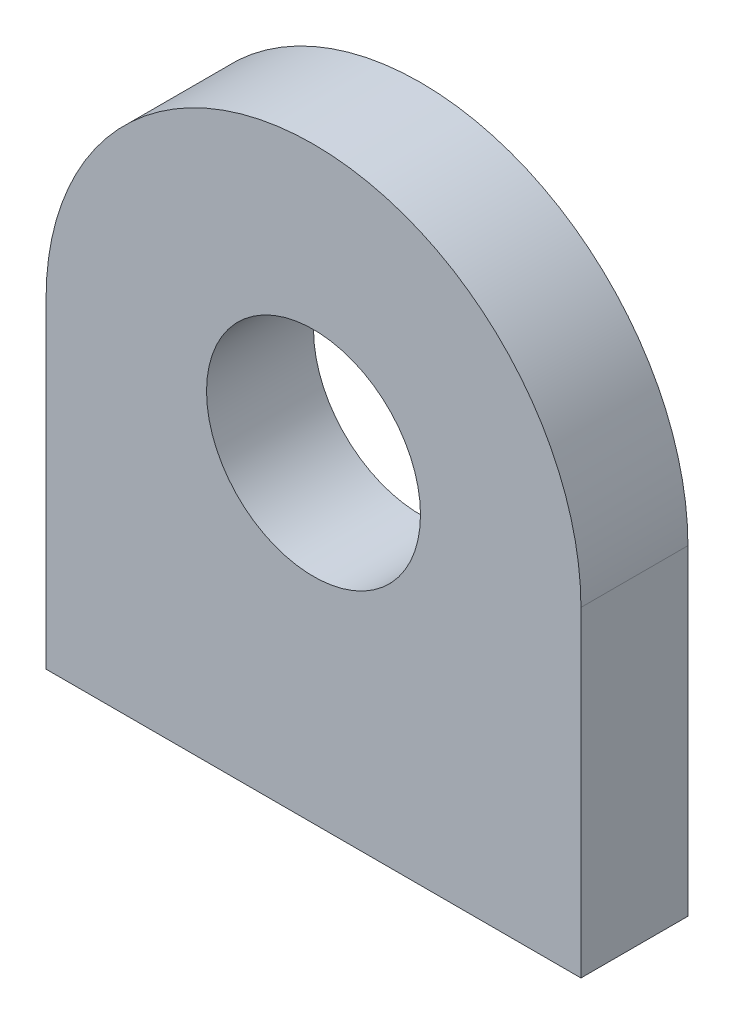
ISO-10303-21;
HEADER;
FILE_DESCRIPTION(('STEP AP214'),'2;1');
FILE_NAME('part.step','',(''),(''),'','','');
FILE_SCHEMA(('AUTOMOTIVE_DESIGN { 1 0 10303 214 1 1 1 1 }'));
ENDSEC;
DATA;
#1=APPLICATION_CONTEXT('core data for automotive mechanical design processes');
#2=APPLICATION_PROTOCOL_DEFINITION('international standard','automotive_design',2000,#1);
#3=PRODUCT_CONTEXT('',#1,'mechanical');
#4=PRODUCT('Part','Part','',(#3));
#5=PRODUCT_RELATED_PRODUCT_CATEGORY('part','',(#4));
#6=PRODUCT_DEFINITION_FORMATION('','',#4);
#7=PRODUCT_DEFINITION_CONTEXT('part definition',#1,'design');
#8=PRODUCT_DEFINITION('design','',#6,#7);
#9=PRODUCT_DEFINITION_SHAPE('','',#8);
#10=(LENGTH_UNIT() NAMED_UNIT(*) SI_UNIT(.MILLI.,.METRE.));
#11=(NAMED_UNIT(*) PLANE_ANGLE_UNIT() SI_UNIT($,.RADIAN.));
#12=(NAMED_UNIT(*) SI_UNIT($,.STERADIAN.) SOLID_ANGLE_UNIT());
#13=UNCERTAINTY_MEASURE_WITH_UNIT(LENGTH_MEASURE(1.E-05),#10,'distance_accuracy_value','');
#14=(GEOMETRIC_REPRESENTATION_CONTEXT(3) GLOBAL_UNCERTAINTY_ASSIGNED_CONTEXT((#13)) GLOBAL_UNIT_ASSIGNED_CONTEXT((#10,
#11,#12)) REPRESENTATION_CONTEXT('',''));
#15=CARTESIAN_POINT('',(0.,0.,0.));
#16=DIRECTION('',(0.,0.,1.));
#17=DIRECTION('',(1.,0.,0.));
#18=AXIS2_PLACEMENT_3D('',#15,#16,#17);
#19=CARTESIAN_POINT('',(0.,0.,10.));
#20=DIRECTION('',(0.,0.,-1.));
#21=DIRECTION('',(-1.,0.,0.));
#22=AXIS2_PLACEMENT_3D('',#19,#20,#21);
#23=CYLINDRICAL_SURFACE('',#22,25.);
#24=CARTESIAN_POINT('',(0.,0.,0.));
#25=DIRECTION('',(0.,0.,1.));
#26=DIRECTION('',(1.,0.,0.));
#27=AXIS2_PLACEMENT_3D('',#24,#25,#26);
#28=CIRCLE('',#27,25.);
#29=CARTESIAN_POINT('',(25.,0.,0.));
#30=VERTEX_POINT('',#29);
#31=CARTESIAN_POINT('',(-25.,0.,0.));
#32=VERTEX_POINT('',#31);
#33=EDGE_CURVE('E95',#30,#32,#28,.T.);
#34=ORIENTED_EDGE('',*,*,#33,.T.);
#35=DIRECTION('',(0.,0.,-1.));
#36=VECTOR('',#35,1.);
#37=CARTESIAN_POINT('',(-25.,0.,10.));
#38=LINE('',#37,#36);
#39=CARTESIAN_POINT('',(-25.,0.,10.));
#40=VERTEX_POINT('',#39);
#41=EDGE_CURVE('E11',#40,#32,#38,.T.);
#42=ORIENTED_EDGE('',*,*,#41,.F.);
#43=CARTESIAN_POINT('',(0.,0.,10.));
#44=DIRECTION('',(0.,0.,1.));
#45=DIRECTION('',(1.,0.,0.));
#46=AXIS2_PLACEMENT_3D('',#43,#44,#45);
#47=CIRCLE('',#46,25.);
#48=CARTESIAN_POINT('',(25.,0.,10.));
#49=VERTEX_POINT('',#48);
#50=EDGE_CURVE('E83',#49,#40,#47,.T.);
#51=ORIENTED_EDGE('',*,*,#50,.F.);
#52=DIRECTION('',(0.,0.,-1.));
#53=VECTOR('',#52,1.);
#54=CARTESIAN_POINT('',(25.,0.,10.));
#55=LINE('',#54,#53);
#56=EDGE_CURVE('E91',#49,#30,#55,.T.);
#57=ORIENTED_EDGE('',*,*,#56,.T.);
#58=EDGE_LOOP('',(#34,#42,#51,#57));
#59=FACE_BOUND('',#58,.T.);
#60=ADVANCED_FACE('F32',(#59),#23,.T.);
#61=CARTESIAN_POINT('',(-25.,0.,10.));
#62=DIRECTION('',(1.,0.,0.));
#63=DIRECTION('',(0.,0.,-1.));
#64=AXIS2_PLACEMENT_3D('',#61,#62,#63);
#65=PLANE('',#64);
#66=DIRECTION('',(0.,-1.,0.));
#67=VECTOR('',#66,1.);
#68=CARTESIAN_POINT('',(-25.,0.,0.));
#69=LINE('',#68,#67);
#70=CARTESIAN_POINT('',(-25.,-30.,0.));
#71=VERTEX_POINT('',#70);
#72=EDGE_CURVE('E87',#32,#71,#69,.T.);
#73=ORIENTED_EDGE('',*,*,#72,.T.);
#74=DIRECTION('',(0.,0.,-1.));
#75=VECTOR('',#74,1.);
#76=CARTESIAN_POINT('',(-25.,-30.,10.));
#77=LINE('',#76,#75);
#78=CARTESIAN_POINT('',(-25.,-30.,10.));
#79=VERTEX_POINT('',#78);
#80=EDGE_CURVE('E40',#79,#71,#77,.T.);
#81=ORIENTED_EDGE('',*,*,#80,.F.);
#82=DIRECTION('',(0.,-1.,0.));
#83=VECTOR('',#82,1.);
#84=CARTESIAN_POINT('',(-25.,0.,10.));
#85=LINE('',#84,#83);
#86=EDGE_CURVE('E78',#40,#79,#85,.T.);
#87=ORIENTED_EDGE('',*,*,#86,.F.);
#88=ORIENTED_EDGE('',*,*,#41,.T.);
#89=EDGE_LOOP('',(#73,#81,#87,#88));
#90=FACE_BOUND('',#89,.T.);
#91=ADVANCED_FACE('F86',(#90),#65,.F.);
#92=CARTESIAN_POINT('',(-25.,-30.,10.));
#93=DIRECTION('',(0.,1.,0.));
#94=DIRECTION('',(0.,0.,1.));
#95=AXIS2_PLACEMENT_3D('',#92,#93,#94);
#96=PLANE('',#95);
#97=DIRECTION('',(1.,0.,0.));
#98=VECTOR('',#97,1.);
#99=CARTESIAN_POINT('',(-25.,-30.,0.));
#100=LINE('',#99,#98);
#101=CARTESIAN_POINT('',(25.,-30.,0.));
#102=VERTEX_POINT('',#101);
#103=EDGE_CURVE('E65',#71,#102,#100,.T.);
#104=ORIENTED_EDGE('',*,*,#103,.T.);
#105=DIRECTION('',(0.,0.,-1.));
#106=VECTOR('',#105,1.);
#107=CARTESIAN_POINT('',(25.,-30.,10.));
#108=LINE('',#107,#106);
#109=CARTESIAN_POINT('',(25.,-30.,10.));
#110=VERTEX_POINT('',#109);
#111=EDGE_CURVE('E88',#110,#102,#108,.T.);
#112=ORIENTED_EDGE('',*,*,#111,.F.);
#113=DIRECTION('',(1.,0.,0.));
#114=VECTOR('',#113,1.);
#115=CARTESIAN_POINT('',(-25.,-30.,10.));
#116=LINE('',#115,#114);
#117=EDGE_CURVE('E81',#79,#110,#116,.T.);
#118=ORIENTED_EDGE('',*,*,#117,.F.);
#119=ORIENTED_EDGE('',*,*,#80,.T.);
#120=EDGE_LOOP('',(#104,#112,#118,#119));
#121=FACE_BOUND('',#120,.T.);
#122=ADVANCED_FACE('F89',(#121),#96,.F.);
#123=CARTESIAN_POINT('',(25.,-30.,10.));
#124=DIRECTION('',(-1.,0.,0.));
#125=DIRECTION('',(0.,0.,1.));
#126=AXIS2_PLACEMENT_3D('',#123,#124,#125);
#127=PLANE('',#126);
#128=DIRECTION('',(0.,1.,0.));
#129=VECTOR('',#128,1.);
#130=CARTESIAN_POINT('',(25.,-30.,0.));
#131=LINE('',#130,#129);
#132=EDGE_CURVE('E71',#102,#30,#131,.T.);
#133=ORIENTED_EDGE('',*,*,#132,.T.);
#134=ORIENTED_EDGE('',*,*,#56,.F.);
#135=DIRECTION('',(0.,1.,0.));
#136=VECTOR('',#135,1.);
#137=CARTESIAN_POINT('',(25.,-30.,10.));
#138=LINE('',#137,#136);
#139=EDGE_CURVE('E48',#110,#49,#138,.T.);
#140=ORIENTED_EDGE('',*,*,#139,.F.);
#141=ORIENTED_EDGE('',*,*,#111,.T.);
#142=EDGE_LOOP('',(#133,#134,#140,#141));
#143=FACE_BOUND('',#142,.T.);
#144=ADVANCED_FACE('F103',(#143),#127,.F.);
#145=CARTESIAN_POINT('',(0.,0.,10.));
#146=DIRECTION('',(0.,0.,1.));
#147=DIRECTION('',(1.,0.,0.));
#148=AXIS2_PLACEMENT_3D('',#145,#146,#147);
#149=PLANE('',#148);
#150=CARTESIAN_POINT('',(0.,0.,10.));
#151=DIRECTION('',(0.,0.,1.));
#152=DIRECTION('',(1.,0.,0.));
#153=AXIS2_PLACEMENT_3D('',#150,#151,#152);
#154=CIRCLE('',#153,10.);
#155=CARTESIAN_POINT('',(10.,0.,10.));
#156=VERTEX_POINT('',#155);
#157=EDGE_CURVE('E109',#156,#156,#154,.T.);
#158=ORIENTED_EDGE('',*,*,#157,.F.);
#159=EDGE_LOOP('',(#158));
#160=FACE_BOUND('',#159,.T.);
#161=ORIENTED_EDGE('',*,*,#50,.T.);
#162=ORIENTED_EDGE('',*,*,#86,.T.);
#163=ORIENTED_EDGE('',*,*,#117,.T.);
#164=ORIENTED_EDGE('',*,*,#139,.T.);
#165=EDGE_LOOP('',(#161,#162,#163,#164));
#166=FACE_BOUND('',#165,.T.);
#167=ADVANCED_FACE('F79',(#160,#166),#149,.T.);
#168=CARTESIAN_POINT('',(0.,0.,0.));
#169=DIRECTION('',(0.,0.,1.));
#170=DIRECTION('',(1.,0.,0.));
#171=AXIS2_PLACEMENT_3D('',#168,#169,#170);
#172=PLANE('',#171);
#173=CARTESIAN_POINT('',(0.,0.,0.));
#174=DIRECTION('',(0.,0.,1.));
#175=DIRECTION('',(1.,0.,0.));
#176=AXIS2_PLACEMENT_3D('',#173,#174,#175);
#177=CIRCLE('',#176,10.);
#178=CARTESIAN_POINT('',(10.,0.,0.));
#179=VERTEX_POINT('',#178);
#180=EDGE_CURVE('E98',#179,#179,#177,.T.);
#181=ORIENTED_EDGE('',*,*,#180,.T.);
#182=EDGE_LOOP('',(#181));
#183=FACE_BOUND('',#182,.T.);
#184=ORIENTED_EDGE('',*,*,#33,.F.);
#185=ORIENTED_EDGE('',*,*,#132,.F.);
#186=ORIENTED_EDGE('',*,*,#103,.F.);
#187=ORIENTED_EDGE('',*,*,#72,.F.);
#188=EDGE_LOOP('',(#184,#185,#186,#187));
#189=FACE_BOUND('',#188,.T.);
#190=ADVANCED_FACE('F106',(#183,#189),#172,.F.);
#191=CARTESIAN_POINT('',(0.,0.,0.));
#192=DIRECTION('',(0.,0.,1.));
#193=DIRECTION('',(1.,0.,0.));
#194=AXIS2_PLACEMENT_3D('',#191,#192,#193);
#195=CYLINDRICAL_SURFACE('',#194,10.);
#196=ORIENTED_EDGE('',*,*,#180,.F.);
#197=EDGE_LOOP('',(#196));
#198=FACE_BOUND('',#197,.T.);
#199=ORIENTED_EDGE('',*,*,#157,.T.);
#200=EDGE_LOOP('',(#199));
#201=FACE_BOUND('',#200,.T.);
#202=ADVANCED_FACE('F116',(#198,#201),#195,.F.);
#203=CLOSED_SHELL('',(#60,#91,#122,#144,#167,#190,#202));
#204=MANIFOLD_SOLID_BREP('B2',#203);
#205=ADVANCED_BREP_SHAPE_REPRESENTATION('',(#18,#204),#14);
#206=SHAPE_DEFINITION_REPRESENTATION(#9,#205);
ENDSEC;
END-ISO-10303-21;
